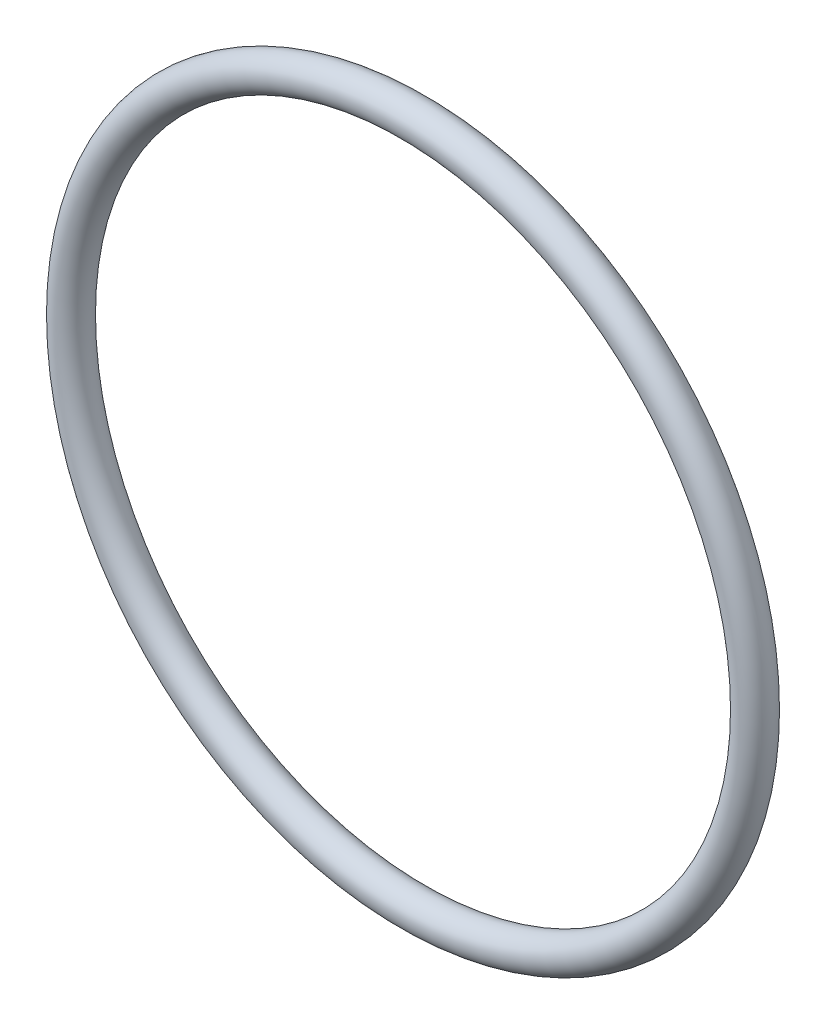
ISO-10303-21;
HEADER;
FILE_DESCRIPTION(('STEP AP214'),'2;1');
FILE_NAME('part.step','',(''),(''),'','','');
FILE_SCHEMA(('AUTOMOTIVE_DESIGN { 1 0 10303 214 1 1 1 1 }'));
ENDSEC;
DATA;
#1=APPLICATION_CONTEXT('core data for automotive mechanical design processes');
#2=APPLICATION_PROTOCOL_DEFINITION('international standard','automotive_design',2000,#1);
#3=PRODUCT_CONTEXT('',#1,'mechanical');
#4=PRODUCT('Part','Part','',(#3));
#5=PRODUCT_RELATED_PRODUCT_CATEGORY('part','',(#4));
#6=PRODUCT_DEFINITION_FORMATION('','',#4);
#7=PRODUCT_DEFINITION_CONTEXT('part definition',#1,'design');
#8=PRODUCT_DEFINITION('design','',#6,#7);
#9=PRODUCT_DEFINITION_SHAPE('','',#8);
#10=(LENGTH_UNIT() NAMED_UNIT(*) SI_UNIT(.MILLI.,.METRE.));
#11=(NAMED_UNIT(*) PLANE_ANGLE_UNIT() SI_UNIT($,.RADIAN.));
#12=(NAMED_UNIT(*) SI_UNIT($,.STERADIAN.) SOLID_ANGLE_UNIT());
#13=UNCERTAINTY_MEASURE_WITH_UNIT(LENGTH_MEASURE(1.E-05),#10,'distance_accuracy_value','');
#14=(GEOMETRIC_REPRESENTATION_CONTEXT(3) GLOBAL_UNCERTAINTY_ASSIGNED_CONTEXT((#13)) GLOBAL_UNIT_ASSIGNED_CONTEXT((#10,
#11,#12)) REPRESENTATION_CONTEXT('',''));
#15=CARTESIAN_POINT('',(0.,0.,0.));
#16=DIRECTION('',(0.,0.,1.));
#17=DIRECTION('',(1.,0.,0.));
#18=AXIS2_PLACEMENT_3D('',#15,#16,#17);
#19=CARTESIAN_POINT('',(0.,0.,0.));
#20=DIRECTION('',(0.,0.,-1.));
#21=DIRECTION('',(-1.,0.,0.));
#22=AXIS2_PLACEMENT_3D('',#19,#20,#21);
#23=TOROIDAL_SURFACE('',#22,14.8,0.750000000000002);
#24=CARTESIAN_POINT('',(-15.55,0.,0.));
#25=VERTEX_POINT('',#24);
#26=VERTEX_LOOP('',#25);
#27=FACE_BOUND('',#26,.T.);
#28=ADVANCED_FACE('F36',(#27),#23,.T.);
#29=CLOSED_SHELL('',(#28));
#30=MANIFOLD_SOLID_BREP('B2',#29);
#31=ADVANCED_BREP_SHAPE_REPRESENTATION('',(#18,#30),#14);
#32=SHAPE_DEFINITION_REPRESENTATION(#9,#31);
ENDSEC;
END-ISO-10303-21;
